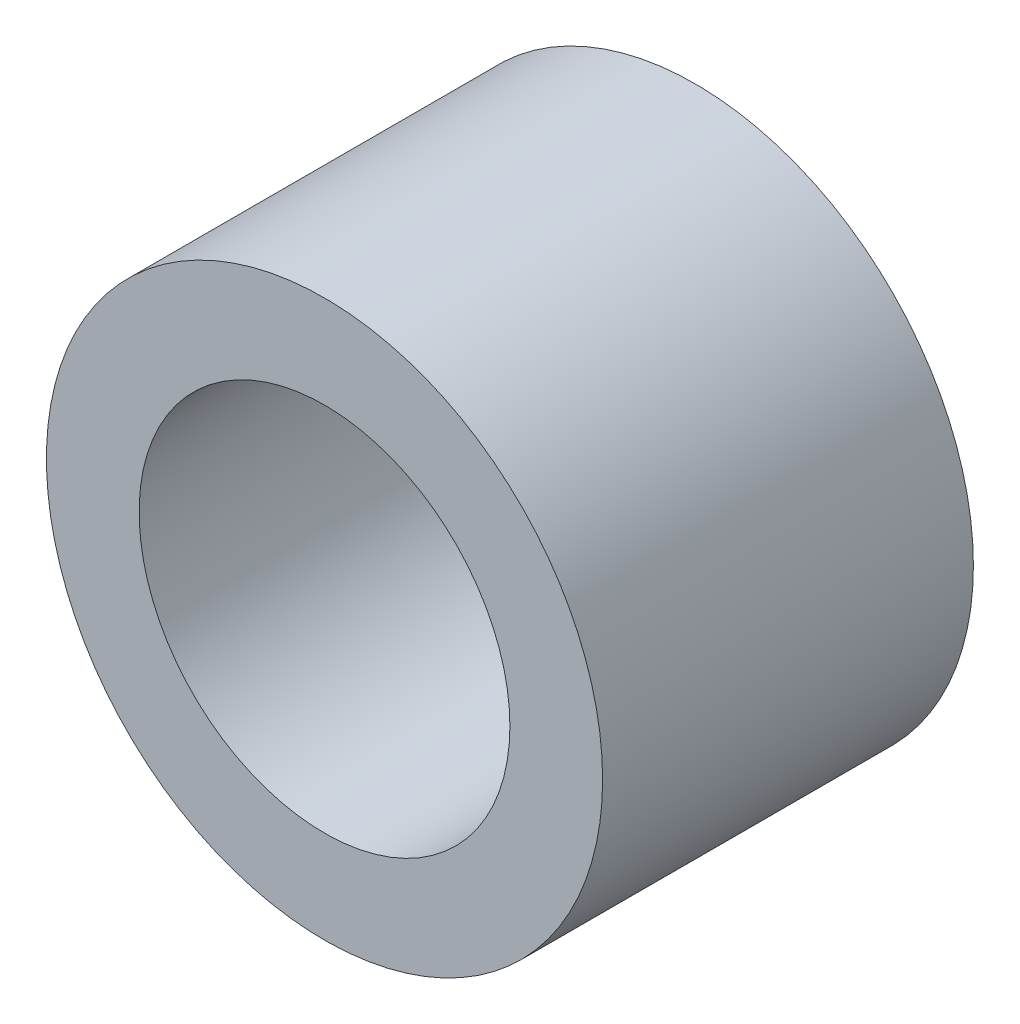
ISO-10303-21;
HEADER;
FILE_DESCRIPTION(('STEP AP214'),'2;1');
FILE_NAME('part.step','',(''),(''),'','','');
FILE_SCHEMA(('AUTOMOTIVE_DESIGN { 1 0 10303 214 1 1 1 1 }'));
ENDSEC;
DATA;
#1=APPLICATION_CONTEXT('core data for automotive mechanical design processes');
#2=APPLICATION_PROTOCOL_DEFINITION('international standard','automotive_design',2000,#1);
#3=PRODUCT_CONTEXT('',#1,'mechanical');
#4=PRODUCT('Part','Part','',(#3));
#5=PRODUCT_RELATED_PRODUCT_CATEGORY('part','',(#4));
#6=PRODUCT_DEFINITION_FORMATION('','',#4);
#7=PRODUCT_DEFINITION_CONTEXT('part definition',#1,'design');
#8=PRODUCT_DEFINITION('design','',#6,#7);
#9=PRODUCT_DEFINITION_SHAPE('','',#8);
#10=(LENGTH_UNIT() NAMED_UNIT(*) SI_UNIT(.MILLI.,.METRE.));
#11=(NAMED_UNIT(*) PLANE_ANGLE_UNIT() SI_UNIT($,.RADIAN.));
#12=(NAMED_UNIT(*) SI_UNIT($,.STERADIAN.) SOLID_ANGLE_UNIT());
#13=UNCERTAINTY_MEASURE_WITH_UNIT(LENGTH_MEASURE(1.E-05),#10,'distance_accuracy_value','');
#14=(GEOMETRIC_REPRESENTATION_CONTEXT(3) GLOBAL_UNCERTAINTY_ASSIGNED_CONTEXT((#13)) GLOBAL_UNIT_ASSIGNED_CONTEXT((#10,
#11,#12)) REPRESENTATION_CONTEXT('',''));
#15=CARTESIAN_POINT('',(0.,0.,0.));
#16=DIRECTION('',(0.,0.,1.));
#17=DIRECTION('',(1.,0.,0.));
#18=AXIS2_PLACEMENT_3D('',#15,#16,#17);
#19=CARTESIAN_POINT('',(0.,0.,5.));
#20=DIRECTION('',(0.,0.,1.));
#21=DIRECTION('',(1.,0.,0.));
#22=AXIS2_PLACEMENT_3D('',#19,#20,#21);
#23=PLANE('',#22);
#24=CARTESIAN_POINT('',(0.,0.,5.));
#25=DIRECTION('',(0.,0.,1.));
#26=DIRECTION('',(1.,0.,0.));
#27=AXIS2_PLACEMENT_3D('',#24,#25,#26);
#28=CIRCLE('',#27,7.5);
#29=CARTESIAN_POINT('',(7.5,0.,5.));
#30=VERTEX_POINT('',#29);
#31=EDGE_CURVE('E10',#30,#30,#28,.T.);
#32=ORIENTED_EDGE('',*,*,#31,.T.);
#33=EDGE_LOOP('',(#32));
#34=FACE_BOUND('',#33,.T.);
#35=CARTESIAN_POINT('',(0.,0.,5.));
#36=DIRECTION('',(0.,0.,1.));
#37=DIRECTION('',(1.,0.,0.));
#38=AXIS2_PLACEMENT_3D('',#35,#36,#37);
#39=CIRCLE('',#38,5.);
#40=CARTESIAN_POINT('',(5.,0.,5.));
#41=VERTEX_POINT('',#40);
#42=EDGE_CURVE('E42',#41,#41,#39,.T.);
#43=ORIENTED_EDGE('',*,*,#42,.F.);
#44=EDGE_LOOP('',(#43));
#45=FACE_BOUND('',#44,.T.);
#46=ADVANCED_FACE('F31',(#34,#45),#23,.T.);
#47=CARTESIAN_POINT('',(0.,0.,-5.));
#48=DIRECTION('',(0.,0.,1.));
#49=DIRECTION('',(1.,0.,0.));
#50=AXIS2_PLACEMENT_3D('',#47,#48,#49);
#51=PLANE('',#50);
#52=CARTESIAN_POINT('',(0.,0.,-5.));
#53=DIRECTION('',(0.,0.,1.));
#54=DIRECTION('',(1.,0.,0.));
#55=AXIS2_PLACEMENT_3D('',#52,#53,#54);
#56=CIRCLE('',#55,7.5);
#57=CARTESIAN_POINT('',(7.5,0.,-5.));
#58=VERTEX_POINT('',#57);
#59=EDGE_CURVE('E35',#58,#58,#56,.T.);
#60=ORIENTED_EDGE('',*,*,#59,.F.);
#61=EDGE_LOOP('',(#60));
#62=FACE_BOUND('',#61,.T.);
#63=CARTESIAN_POINT('',(0.,0.,-5.));
#64=DIRECTION('',(0.,0.,1.));
#65=DIRECTION('',(1.,0.,0.));
#66=AXIS2_PLACEMENT_3D('',#63,#64,#65);
#67=CIRCLE('',#66,5.);
#68=CARTESIAN_POINT('',(5.,0.,-5.));
#69=VERTEX_POINT('',#68);
#70=EDGE_CURVE('E44',#69,#69,#67,.T.);
#71=ORIENTED_EDGE('',*,*,#70,.T.);
#72=EDGE_LOOP('',(#71));
#73=FACE_BOUND('',#72,.T.);
#74=ADVANCED_FACE('F54',(#62,#73),#51,.F.);
#75=CARTESIAN_POINT('',(0.,0.,5.));
#76=DIRECTION('',(0.,0.,-1.));
#77=DIRECTION('',(-1.,0.,0.));
#78=AXIS2_PLACEMENT_3D('',#75,#76,#77);
#79=CYLINDRICAL_SURFACE('',#78,7.5);
#80=ORIENTED_EDGE('',*,*,#31,.F.);
#81=EDGE_LOOP('',(#80));
#82=FACE_BOUND('',#81,.T.);
#83=ORIENTED_EDGE('',*,*,#59,.T.);
#84=EDGE_LOOP('',(#83));
#85=FACE_BOUND('',#84,.T.);
#86=ADVANCED_FACE('F33',(#82,#85),#79,.T.);
#87=CARTESIAN_POINT('',(0.,0.,5.));
#88=DIRECTION('',(0.,0.,-1.));
#89=DIRECTION('',(-1.,0.,0.));
#90=AXIS2_PLACEMENT_3D('',#87,#88,#89);
#91=CYLINDRICAL_SURFACE('',#90,5.);
#92=ORIENTED_EDGE('',*,*,#42,.T.);
#93=EDGE_LOOP('',(#92));
#94=FACE_BOUND('',#93,.T.);
#95=ORIENTED_EDGE('',*,*,#70,.F.);
#96=EDGE_LOOP('',(#95));
#97=FACE_BOUND('',#96,.T.);
#98=ADVANCED_FACE('F50',(#94,#97),#91,.F.);
#99=CLOSED_SHELL('',(#46,#74,#86,#98));
#100=MANIFOLD_SOLID_BREP('B2',#99);
#101=ADVANCED_BREP_SHAPE_REPRESENTATION('',(#18,#100),#14);
#102=SHAPE_DEFINITION_REPRESENTATION(#9,#101);
ENDSEC;
END-ISO-10303-21;
